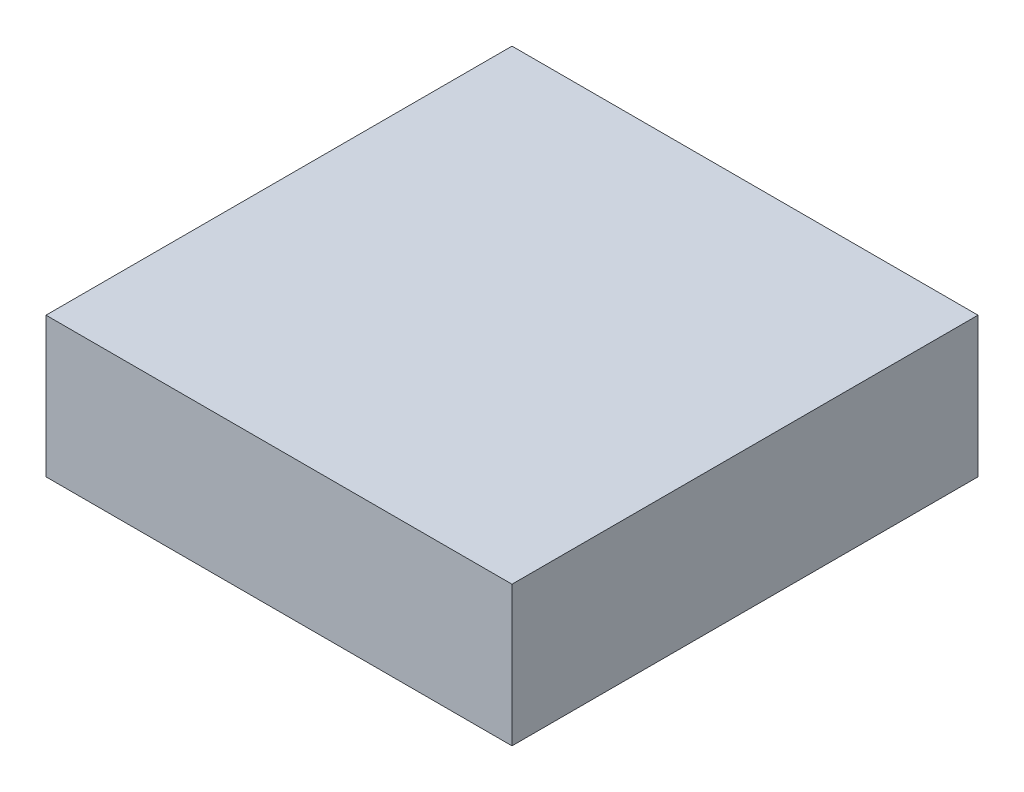
ISO-10303-21;
HEADER;
FILE_DESCRIPTION(('STEP AP214'),'2;1');
FILE_NAME('part.step','',(''),(''),'','','');
FILE_SCHEMA(('AUTOMOTIVE_DESIGN { 1 0 10303 214 1 1 1 1 }'));
ENDSEC;
DATA;
#1=APPLICATION_CONTEXT('core data for automotive mechanical design processes');
#2=APPLICATION_PROTOCOL_DEFINITION('international standard','automotive_design',2000,#1);
#3=PRODUCT_CONTEXT('',#1,'mechanical');
#4=PRODUCT('Part','Part','',(#3));
#5=PRODUCT_RELATED_PRODUCT_CATEGORY('part','',(#4));
#6=PRODUCT_DEFINITION_FORMATION('','',#4);
#7=PRODUCT_DEFINITION_CONTEXT('part definition',#1,'design');
#8=PRODUCT_DEFINITION('design','',#6,#7);
#9=PRODUCT_DEFINITION_SHAPE('','',#8);
#10=(LENGTH_UNIT() NAMED_UNIT(*) SI_UNIT(.MILLI.,.METRE.));
#11=(NAMED_UNIT(*) PLANE_ANGLE_UNIT() SI_UNIT($,.RADIAN.));
#12=(NAMED_UNIT(*) SI_UNIT($,.STERADIAN.) SOLID_ANGLE_UNIT());
#13=UNCERTAINTY_MEASURE_WITH_UNIT(LENGTH_MEASURE(1.E-05),#10,'distance_accuracy_value','');
#14=(GEOMETRIC_REPRESENTATION_CONTEXT(3) GLOBAL_UNCERTAINTY_ASSIGNED_CONTEXT((#13)) GLOBAL_UNIT_ASSIGNED_CONTEXT((#10,
#11,#12)) REPRESENTATION_CONTEXT('',''));
#15=CARTESIAN_POINT('',(0.,0.,0.));
#16=DIRECTION('',(0.,0.,1.));
#17=DIRECTION('',(1.,0.,0.));
#18=AXIS2_PLACEMENT_3D('',#15,#16,#17);
#19=CARTESIAN_POINT('',(20.3,12.2,20.3));
#20=DIRECTION('',(-1.,0.,0.));
#21=DIRECTION('',(0.,0.,1.));
#22=AXIS2_PLACEMENT_3D('',#19,#20,#21);
#23=PLANE('',#22);
#24=DIRECTION('',(0.,0.,-1.));
#25=VECTOR('',#24,1.);
#26=CARTESIAN_POINT('',(20.3,0.,20.3));
#27=LINE('',#26,#25);
#28=CARTESIAN_POINT('',(20.3,0.,20.3));
#29=VERTEX_POINT('',#28);
#30=CARTESIAN_POINT('',(20.3,0.,-20.3));
#31=VERTEX_POINT('',#30);
#32=EDGE_CURVE('E95',#29,#31,#27,.T.);
#33=ORIENTED_EDGE('',*,*,#32,.T.);
#34=DIRECTION('',(0.,-1.,0.));
#35=VECTOR('',#34,1.);
#36=CARTESIAN_POINT('',(20.3,12.2,-20.3));
#37=LINE('',#36,#35);
#38=CARTESIAN_POINT('',(20.3,12.2,-20.3));
#39=VERTEX_POINT('',#38);
#40=EDGE_CURVE('E11',#39,#31,#37,.T.);
#41=ORIENTED_EDGE('',*,*,#40,.F.);
#42=DIRECTION('',(0.,0.,-1.));
#43=VECTOR('',#42,1.);
#44=CARTESIAN_POINT('',(20.3,12.2,20.3));
#45=LINE('',#44,#43);
#46=CARTESIAN_POINT('',(20.3,12.2,20.3));
#47=VERTEX_POINT('',#46);
#48=EDGE_CURVE('E83',#47,#39,#45,.T.);
#49=ORIENTED_EDGE('',*,*,#48,.F.);
#50=DIRECTION('',(0.,-1.,0.));
#51=VECTOR('',#50,1.);
#52=CARTESIAN_POINT('',(20.3,12.2,20.3));
#53=LINE('',#52,#51);
#54=EDGE_CURVE('E91',#47,#29,#53,.T.);
#55=ORIENTED_EDGE('',*,*,#54,.T.);
#56=EDGE_LOOP('',(#33,#41,#49,#55));
#57=FACE_BOUND('',#56,.T.);
#58=ADVANCED_FACE('F32',(#57),#23,.F.);
#59=CARTESIAN_POINT('',(-20.3,12.2,-20.3));
#60=DIRECTION('',(0.,0.,1.));
#61=DIRECTION('',(1.,0.,0.));
#62=AXIS2_PLACEMENT_3D('',#59,#60,#61);
#63=PLANE('',#62);
#64=DIRECTION('',(-1.,0.,0.));
#65=VECTOR('',#64,1.);
#66=CARTESIAN_POINT('',(-20.3,0.,-20.3));
#67=LINE('',#66,#65);
#68=CARTESIAN_POINT('',(-20.3,0.,-20.3));
#69=VERTEX_POINT('',#68);
#70=EDGE_CURVE('E87',#31,#69,#67,.T.);
#71=ORIENTED_EDGE('',*,*,#70,.T.);
#72=DIRECTION('',(0.,-1.,0.));
#73=VECTOR('',#72,1.);
#74=CARTESIAN_POINT('',(-20.3,12.2,-20.3));
#75=LINE('',#74,#73);
#76=CARTESIAN_POINT('',(-20.3,12.2,-20.3));
#77=VERTEX_POINT('',#76);
#78=EDGE_CURVE('E40',#77,#69,#75,.T.);
#79=ORIENTED_EDGE('',*,*,#78,.F.);
#80=DIRECTION('',(-1.,0.,0.));
#81=VECTOR('',#80,1.);
#82=CARTESIAN_POINT('',(-20.3,12.2,-20.3));
#83=LINE('',#82,#81);
#84=EDGE_CURVE('E78',#39,#77,#83,.T.);
#85=ORIENTED_EDGE('',*,*,#84,.F.);
#86=ORIENTED_EDGE('',*,*,#40,.T.);
#87=EDGE_LOOP('',(#71,#79,#85,#86));
#88=FACE_BOUND('',#87,.T.);
#89=ADVANCED_FACE('F86',(#88),#63,.F.);
#90=CARTESIAN_POINT('',(-20.3,12.2,20.3));
#91=DIRECTION('',(1.,0.,0.));
#92=DIRECTION('',(0.,0.,-1.));
#93=AXIS2_PLACEMENT_3D('',#90,#91,#92);
#94=PLANE('',#93);
#95=DIRECTION('',(0.,0.,1.));
#96=VECTOR('',#95,1.);
#97=CARTESIAN_POINT('',(-20.3,0.,20.3));
#98=LINE('',#97,#96);
#99=CARTESIAN_POINT('',(-20.3,0.,20.3));
#100=VERTEX_POINT('',#99);
#101=EDGE_CURVE('E65',#69,#100,#98,.T.);
#102=ORIENTED_EDGE('',*,*,#101,.T.);
#103=DIRECTION('',(0.,-1.,0.));
#104=VECTOR('',#103,1.);
#105=CARTESIAN_POINT('',(-20.3,12.2,20.3));
#106=LINE('',#105,#104);
#107=CARTESIAN_POINT('',(-20.3,12.2,20.3));
#108=VERTEX_POINT('',#107);
#109=EDGE_CURVE('E88',#108,#100,#106,.T.);
#110=ORIENTED_EDGE('',*,*,#109,.F.);
#111=DIRECTION('',(0.,0.,1.));
#112=VECTOR('',#111,1.);
#113=CARTESIAN_POINT('',(-20.3,12.2,20.3));
#114=LINE('',#113,#112);
#115=EDGE_CURVE('E81',#77,#108,#114,.T.);
#116=ORIENTED_EDGE('',*,*,#115,.F.);
#117=ORIENTED_EDGE('',*,*,#78,.T.);
#118=EDGE_LOOP('',(#102,#110,#116,#117));
#119=FACE_BOUND('',#118,.T.);
#120=ADVANCED_FACE('F89',(#119),#94,.F.);
#121=CARTESIAN_POINT('',(-20.3,12.2,20.3));
#122=DIRECTION('',(0.,0.,-1.));
#123=DIRECTION('',(-1.,0.,0.));
#124=AXIS2_PLACEMENT_3D('',#121,#122,#123);
#125=PLANE('',#124);
#126=DIRECTION('',(1.,0.,0.));
#127=VECTOR('',#126,1.);
#128=CARTESIAN_POINT('',(-20.3,0.,20.3));
#129=LINE('',#128,#127);
#130=EDGE_CURVE('E71',#100,#29,#129,.T.);
#131=ORIENTED_EDGE('',*,*,#130,.T.);
#132=ORIENTED_EDGE('',*,*,#54,.F.);
#133=DIRECTION('',(1.,0.,0.));
#134=VECTOR('',#133,1.);
#135=CARTESIAN_POINT('',(-20.3,12.2,20.3));
#136=LINE('',#135,#134);
#137=EDGE_CURVE('E48',#108,#47,#136,.T.);
#138=ORIENTED_EDGE('',*,*,#137,.F.);
#139=ORIENTED_EDGE('',*,*,#109,.T.);
#140=EDGE_LOOP('',(#131,#132,#138,#139));
#141=FACE_BOUND('',#140,.T.);
#142=ADVANCED_FACE('F102',(#141),#125,.F.);
#143=CARTESIAN_POINT('',(0.,12.2,0.));
#144=DIRECTION('',(0.,-1.,0.));
#145=DIRECTION('',(0.,0.,-1.));
#146=AXIS2_PLACEMENT_3D('',#143,#144,#145);
#147=PLANE('',#146);
#148=ORIENTED_EDGE('',*,*,#48,.T.);
#149=ORIENTED_EDGE('',*,*,#84,.T.);
#150=ORIENTED_EDGE('',*,*,#115,.T.);
#151=ORIENTED_EDGE('',*,*,#137,.T.);
#152=EDGE_LOOP('',(#148,#149,#150,#151));
#153=FACE_BOUND('',#152,.T.);
#154=ADVANCED_FACE('F79',(#153),#147,.F.);
#155=CARTESIAN_POINT('',(0.,0.,0.));
#156=DIRECTION('',(0.,-1.,0.));
#157=DIRECTION('',(0.,0.,-1.));
#158=AXIS2_PLACEMENT_3D('',#155,#156,#157);
#159=PLANE('',#158);
#160=ORIENTED_EDGE('',*,*,#32,.F.);
#161=ORIENTED_EDGE('',*,*,#130,.F.);
#162=ORIENTED_EDGE('',*,*,#101,.F.);
#163=ORIENTED_EDGE('',*,*,#70,.F.);
#164=EDGE_LOOP('',(#160,#161,#162,#163));
#165=FACE_BOUND('',#164,.T.);
#166=ADVANCED_FACE('F105',(#165),#159,.T.);
#167=CLOSED_SHELL('',(#58,#89,#120,#142,#154,#166));
#168=MANIFOLD_SOLID_BREP('B2',#167);
#169=ADVANCED_BREP_SHAPE_REPRESENTATION('',(#18,#168),#14);
#170=SHAPE_DEFINITION_REPRESENTATION(#9,#169);
ENDSEC;
END-ISO-10303-21;
